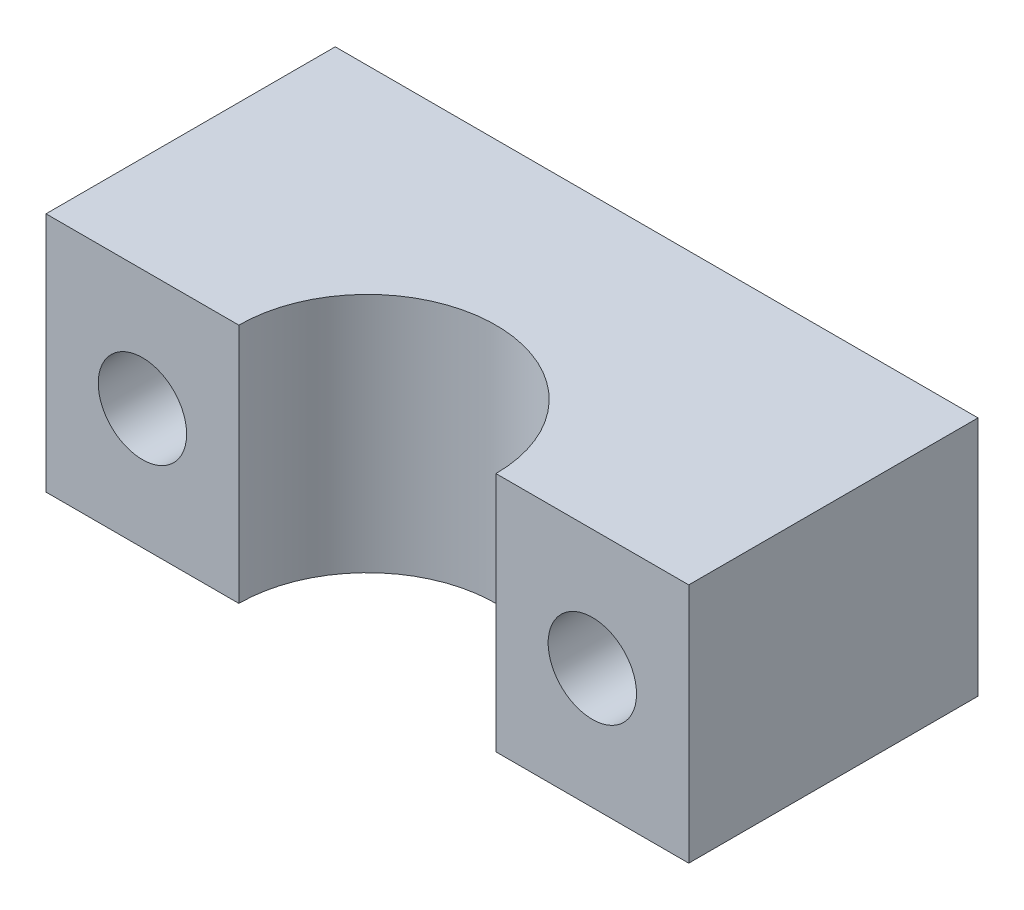
ISO-10303-21;
HEADER;
FILE_DESCRIPTION(('STEP AP214'),'2;1');
FILE_NAME('part.step','',(''),(''),'','','');
FILE_SCHEMA(('AUTOMOTIVE_DESIGN { 1 0 10303 214 1 1 1 1 }'));
ENDSEC;
DATA;
#1=APPLICATION_CONTEXT('core data for automotive mechanical design processes');
#2=APPLICATION_PROTOCOL_DEFINITION('international standard','automotive_design',2000,#1);
#3=PRODUCT_CONTEXT('',#1,'mechanical');
#4=PRODUCT('Part','Part','',(#3));
#5=PRODUCT_RELATED_PRODUCT_CATEGORY('part','',(#4));
#6=PRODUCT_DEFINITION_FORMATION('','',#4);
#7=PRODUCT_DEFINITION_CONTEXT('part definition',#1,'design');
#8=PRODUCT_DEFINITION('design','',#6,#7);
#9=PRODUCT_DEFINITION_SHAPE('','',#8);
#10=(LENGTH_UNIT() NAMED_UNIT(*) SI_UNIT(.MILLI.,.METRE.));
#11=(NAMED_UNIT(*) PLANE_ANGLE_UNIT() SI_UNIT($,.RADIAN.));
#12=(NAMED_UNIT(*) SI_UNIT($,.STERADIAN.) SOLID_ANGLE_UNIT());
#13=UNCERTAINTY_MEASURE_WITH_UNIT(LENGTH_MEASURE(1.E-05),#10,'distance_accuracy_value','');
#14=(GEOMETRIC_REPRESENTATION_CONTEXT(3) GLOBAL_UNCERTAINTY_ASSIGNED_CONTEXT((#13)) GLOBAL_UNIT_ASSIGNED_CONTEXT((#10,
#11,#12)) REPRESENTATION_CONTEXT('',''));
#15=CARTESIAN_POINT('',(0.,0.,0.));
#16=DIRECTION('',(0.,0.,1.));
#17=DIRECTION('',(1.,0.,0.));
#18=AXIS2_PLACEMENT_3D('',#15,#16,#17);
#19=CARTESIAN_POINT('',(0.,0.,18.));
#20=DIRECTION('',(0.,0.,1.));
#21=DIRECTION('',(1.,0.,0.));
#22=AXIS2_PLACEMENT_3D('',#19,#20,#21);
#23=PLANE('',#22);
#24=CARTESIAN_POINT('',(34.,-7.5,18.));
#25=DIRECTION('',(0.,0.,1.));
#26=DIRECTION('',(1.,0.,0.));
#27=AXIS2_PLACEMENT_3D('',#24,#25,#26);
#28=CIRCLE('',#27,2.75);
#29=CARTESIAN_POINT('',(36.75,-7.5,18.));
#30=VERTEX_POINT('',#29);
#31=EDGE_CURVE('E149',#30,#30,#28,.T.);
#32=ORIENTED_EDGE('',*,*,#31,.F.);
#33=EDGE_LOOP('',(#32));
#34=FACE_BOUND('',#33,.T.);
#35=DIRECTION('',(0.,1.,0.));
#36=VECTOR('',#35,1.);
#37=CARTESIAN_POINT('',(28.,-15.,18.));
#38=LINE('',#37,#36);
#39=CARTESIAN_POINT('',(28.,-15.,18.));
#40=VERTEX_POINT('',#39);
#41=CARTESIAN_POINT('',(28.,0.,18.));
#42=VERTEX_POINT('',#41);
#43=EDGE_CURVE('E11',#40,#42,#38,.T.);
#44=ORIENTED_EDGE('',*,*,#43,.F.);
#45=DIRECTION('',(1.,0.,0.));
#46=VECTOR('',#45,1.);
#47=CARTESIAN_POINT('',(0.,-15.,18.));
#48=LINE('',#47,#46);
#49=CARTESIAN_POINT('',(40.,-15.,18.));
#50=VERTEX_POINT('',#49);
#51=EDGE_CURVE('E136',#40,#50,#48,.T.);
#52=ORIENTED_EDGE('',*,*,#51,.T.);
#53=DIRECTION('',(0.,1.,0.));
#54=VECTOR('',#53,1.);
#55=CARTESIAN_POINT('',(40.,0.,18.));
#56=LINE('',#55,#54);
#57=CARTESIAN_POINT('',(40.,0.,18.));
#58=VERTEX_POINT('',#57);
#59=EDGE_CURVE('E111',#50,#58,#56,.T.);
#60=ORIENTED_EDGE('',*,*,#59,.T.);
#61=DIRECTION('',(-1.,0.,0.));
#62=VECTOR('',#61,1.);
#63=CARTESIAN_POINT('',(0.,0.,18.));
#64=LINE('',#63,#62);
#65=EDGE_CURVE('E107',#58,#42,#64,.T.);
#66=ORIENTED_EDGE('',*,*,#65,.T.);
#67=EDGE_LOOP('',(#44,#52,#60,#66));
#68=FACE_BOUND('',#67,.T.);
#69=ADVANCED_FACE('F39',(#34,#68),#23,.T.);
#70=CARTESIAN_POINT('',(0.,0.,18.));
#71=DIRECTION('',(1.,0.,0.));
#72=DIRECTION('',(0.,0.,-1.));
#73=AXIS2_PLACEMENT_3D('',#70,#71,#72);
#74=PLANE('',#73);
#75=DIRECTION('',(0.,-1.,0.));
#76=VECTOR('',#75,1.);
#77=CARTESIAN_POINT('',(0.,0.,0.));
#78=LINE('',#77,#76);
#79=CARTESIAN_POINT('',(0.,0.,0.));
#80=VERTEX_POINT('',#79);
#81=CARTESIAN_POINT('',(0.,-15.,0.));
#82=VERTEX_POINT('',#81);
#83=EDGE_CURVE('E120',#80,#82,#78,.T.);
#84=ORIENTED_EDGE('',*,*,#83,.T.);
#85=DIRECTION('',(0.,0.,-1.));
#86=VECTOR('',#85,1.);
#87=CARTESIAN_POINT('',(0.,-15.,18.));
#88=LINE('',#87,#86);
#89=CARTESIAN_POINT('',(0.,-15.,18.));
#90=VERTEX_POINT('',#89);
#91=EDGE_CURVE('E133',#90,#82,#88,.T.);
#92=ORIENTED_EDGE('',*,*,#91,.F.);
#93=DIRECTION('',(0.,-1.,0.));
#94=VECTOR('',#93,1.);
#95=CARTESIAN_POINT('',(0.,0.,18.));
#96=LINE('',#95,#94);
#97=CARTESIAN_POINT('',(0.,0.,18.));
#98=VERTEX_POINT('',#97);
#99=EDGE_CURVE('E127',#98,#90,#96,.T.);
#100=ORIENTED_EDGE('',*,*,#99,.F.);
#101=DIRECTION('',(0.,0.,-1.));
#102=VECTOR('',#101,1.);
#103=CARTESIAN_POINT('',(0.,0.,18.));
#104=LINE('',#103,#102);
#105=EDGE_CURVE('E113',#98,#80,#104,.T.);
#106=ORIENTED_EDGE('',*,*,#105,.T.);
#107=EDGE_LOOP('',(#84,#92,#100,#106));
#108=FACE_BOUND('',#107,.T.);
#109=ADVANCED_FACE('F41',(#108),#74,.F.);
#110=CARTESIAN_POINT('',(0.,-15.,18.));
#111=DIRECTION('',(0.,1.,0.));
#112=DIRECTION('',(0.,0.,1.));
#113=AXIS2_PLACEMENT_3D('',#110,#111,#112);
#114=PLANE('',#113);
#115=ORIENTED_EDGE('',*,*,#51,.F.);
#116=CARTESIAN_POINT('',(20.,-15.,18.));
#117=DIRECTION('',(0.,1.,0.));
#118=DIRECTION('',(0.,0.,1.));
#119=AXIS2_PLACEMENT_3D('',#116,#117,#118);
#120=CIRCLE('',#119,8.);
#121=CARTESIAN_POINT('',(12.,-15.,18.));
#122=VERTEX_POINT('',#121);
#123=EDGE_CURVE('E101',#40,#122,#120,.T.);
#124=ORIENTED_EDGE('',*,*,#123,.T.);
#125=EDGE_CURVE('E91',#90,#122,#48,.T.);
#126=ORIENTED_EDGE('',*,*,#125,.F.);
#127=ORIENTED_EDGE('',*,*,#91,.T.);
#128=DIRECTION('',(1.,0.,0.));
#129=VECTOR('',#128,1.);
#130=CARTESIAN_POINT('',(0.,-15.,0.));
#131=LINE('',#130,#129);
#132=CARTESIAN_POINT('',(40.,-15.,0.));
#133=VERTEX_POINT('',#132);
#134=EDGE_CURVE('E123',#82,#133,#131,.T.);
#135=ORIENTED_EDGE('',*,*,#134,.T.);
#136=DIRECTION('',(0.,0.,-1.));
#137=VECTOR('',#136,1.);
#138=CARTESIAN_POINT('',(40.,-15.,18.));
#139=LINE('',#138,#137);
#140=EDGE_CURVE('E130',#50,#133,#139,.T.);
#141=ORIENTED_EDGE('',*,*,#140,.F.);
#142=EDGE_LOOP('',(#115,#124,#126,#127,#135,#141));
#143=FACE_BOUND('',#142,.T.);
#144=ADVANCED_FACE('F134',(#143),#114,.F.);
#145=CARTESIAN_POINT('',(40.,0.,18.));
#146=DIRECTION('',(-1.,0.,0.));
#147=DIRECTION('',(0.,0.,1.));
#148=AXIS2_PLACEMENT_3D('',#145,#146,#147);
#149=PLANE('',#148);
#150=DIRECTION('',(0.,1.,0.));
#151=VECTOR('',#150,1.);
#152=CARTESIAN_POINT('',(40.,0.,0.));
#153=LINE('',#152,#151);
#154=CARTESIAN_POINT('',(40.,0.,0.));
#155=VERTEX_POINT('',#154);
#156=EDGE_CURVE('E125',#133,#155,#153,.T.);
#157=ORIENTED_EDGE('',*,*,#156,.T.);
#158=DIRECTION('',(0.,0.,-1.));
#159=VECTOR('',#158,1.);
#160=CARTESIAN_POINT('',(40.,0.,18.));
#161=LINE('',#160,#159);
#162=EDGE_CURVE('E115',#58,#155,#161,.T.);
#163=ORIENTED_EDGE('',*,*,#162,.F.);
#164=ORIENTED_EDGE('',*,*,#59,.F.);
#165=ORIENTED_EDGE('',*,*,#140,.T.);
#166=EDGE_LOOP('',(#157,#163,#164,#165));
#167=FACE_BOUND('',#166,.T.);
#168=ADVANCED_FACE('F180',(#167),#149,.F.);
#169=CARTESIAN_POINT('',(0.,0.,18.));
#170=DIRECTION('',(0.,-1.,0.));
#171=DIRECTION('',(0.,0.,-1.));
#172=AXIS2_PLACEMENT_3D('',#169,#170,#171);
#173=PLANE('',#172);
#174=CARTESIAN_POINT('',(12.,0.,18.));
#175=VERTEX_POINT('',#174);
#176=EDGE_CURVE('E61',#175,#98,#64,.T.);
#177=ORIENTED_EDGE('',*,*,#176,.F.);
#178=CARTESIAN_POINT('',(20.,0.,18.));
#179=DIRECTION('',(0.,1.,0.));
#180=DIRECTION('',(0.,0.,1.));
#181=AXIS2_PLACEMENT_3D('',#178,#179,#180);
#182=CIRCLE('',#181,8.);
#183=EDGE_CURVE('E53',#42,#175,#182,.T.);
#184=ORIENTED_EDGE('',*,*,#183,.F.);
#185=ORIENTED_EDGE('',*,*,#65,.F.);
#186=ORIENTED_EDGE('',*,*,#162,.T.);
#187=DIRECTION('',(-1.,0.,0.));
#188=VECTOR('',#187,1.);
#189=CARTESIAN_POINT('',(0.,0.,0.));
#190=LINE('',#189,#188);
#191=EDGE_CURVE('E83',#155,#80,#190,.T.);
#192=ORIENTED_EDGE('',*,*,#191,.T.);
#193=ORIENTED_EDGE('',*,*,#105,.F.);
#194=EDGE_LOOP('',(#177,#184,#185,#186,#192,#193));
#195=FACE_BOUND('',#194,.T.);
#196=ADVANCED_FACE('F106',(#195),#173,.F.);
#197=CARTESIAN_POINT('',(6.,-7.5,18.));
#198=DIRECTION('',(0.,0.,1.));
#199=DIRECTION('',(1.,0.,0.));
#200=AXIS2_PLACEMENT_3D('',#197,#198,#199);
#201=CIRCLE('',#200,2.75);
#202=CARTESIAN_POINT('',(8.75,-7.5,18.));
#203=VERTEX_POINT('',#202);
#204=EDGE_CURVE('E143',#203,#203,#201,.T.);
#205=ORIENTED_EDGE('',*,*,#204,.F.);
#206=EDGE_LOOP('',(#205));
#207=FACE_BOUND('',#206,.T.);
#208=DIRECTION('',(0.,1.,0.));
#209=VECTOR('',#208,1.);
#210=CARTESIAN_POINT('',(12.,-15.,18.));
#211=LINE('',#210,#209);
#212=EDGE_CURVE('E47',#175,#122,#211,.F.);
#213=ORIENTED_EDGE('',*,*,#212,.F.);
#214=ORIENTED_EDGE('',*,*,#176,.T.);
#215=ORIENTED_EDGE('',*,*,#99,.T.);
#216=ORIENTED_EDGE('',*,*,#125,.T.);
#217=EDGE_LOOP('',(#213,#214,#215,#216));
#218=FACE_BOUND('',#217,.T.);
#219=ADVANCED_FACE('F138',(#207,#218),#23,.T.);
#220=CARTESIAN_POINT('',(0.,0.,0.));
#221=DIRECTION('',(0.,0.,1.));
#222=DIRECTION('',(1.,0.,0.));
#223=AXIS2_PLACEMENT_3D('',#220,#221,#222);
#224=PLANE('',#223);
#225=CARTESIAN_POINT('',(34.,-7.5,0.));
#226=DIRECTION('',(0.,0.,1.));
#227=DIRECTION('',(1.,0.,0.));
#228=AXIS2_PLACEMENT_3D('',#225,#226,#227);
#229=CIRCLE('',#228,2.75);
#230=CARTESIAN_POINT('',(36.75,-7.5,0.));
#231=VERTEX_POINT('',#230);
#232=EDGE_CURVE('E108',#231,#231,#229,.T.);
#233=ORIENTED_EDGE('',*,*,#232,.T.);
#234=EDGE_LOOP('',(#233));
#235=FACE_BOUND('',#234,.T.);
#236=CARTESIAN_POINT('',(6.,-7.5,0.));
#237=DIRECTION('',(0.,0.,1.));
#238=DIRECTION('',(1.,0.,0.));
#239=AXIS2_PLACEMENT_3D('',#236,#237,#238);
#240=CIRCLE('',#239,2.75);
#241=CARTESIAN_POINT('',(8.75,-7.5,0.));
#242=VERTEX_POINT('',#241);
#243=EDGE_CURVE('E146',#242,#242,#240,.T.);
#244=ORIENTED_EDGE('',*,*,#243,.T.);
#245=EDGE_LOOP('',(#244));
#246=FACE_BOUND('',#245,.T.);
#247=ORIENTED_EDGE('',*,*,#83,.F.);
#248=ORIENTED_EDGE('',*,*,#191,.F.);
#249=ORIENTED_EDGE('',*,*,#156,.F.);
#250=ORIENTED_EDGE('',*,*,#134,.F.);
#251=EDGE_LOOP('',(#247,#248,#249,#250));
#252=FACE_BOUND('',#251,.T.);
#253=ADVANCED_FACE('F155',(#235,#246,#252),#224,.F.);
#254=CARTESIAN_POINT('',(20.,-15.,18.));
#255=DIRECTION('',(0.,1.,0.));
#256=DIRECTION('',(0.,0.,1.));
#257=AXIS2_PLACEMENT_3D('',#254,#255,#256);
#258=CYLINDRICAL_SURFACE('',#257,8.);
#259=ORIENTED_EDGE('',*,*,#43,.T.);
#260=ORIENTED_EDGE('',*,*,#183,.T.);
#261=ORIENTED_EDGE('',*,*,#212,.T.);
#262=ORIENTED_EDGE('',*,*,#123,.F.);
#263=EDGE_LOOP('',(#259,#260,#261,#262));
#264=FACE_BOUND('',#263,.T.);
#265=ADVANCED_FACE('F100',(#264),#258,.F.);
#266=CARTESIAN_POINT('',(6.,-7.5,0.));
#267=DIRECTION('',(0.,0.,1.));
#268=DIRECTION('',(1.,0.,0.));
#269=AXIS2_PLACEMENT_3D('',#266,#267,#268);
#270=CYLINDRICAL_SURFACE('',#269,2.75);
#271=ORIENTED_EDGE('',*,*,#243,.F.);
#272=EDGE_LOOP('',(#271));
#273=FACE_BOUND('',#272,.T.);
#274=ORIENTED_EDGE('',*,*,#204,.T.);
#275=EDGE_LOOP('',(#274));
#276=FACE_BOUND('',#275,.T.);
#277=ADVANCED_FACE('F161',(#273,#276),#270,.F.);
#278=CARTESIAN_POINT('',(34.,-7.5,0.));
#279=DIRECTION('',(0.,0.,1.));
#280=DIRECTION('',(1.,0.,0.));
#281=AXIS2_PLACEMENT_3D('',#278,#279,#280);
#282=CYLINDRICAL_SURFACE('',#281,2.75);
#283=ORIENTED_EDGE('',*,*,#232,.F.);
#284=EDGE_LOOP('',(#283));
#285=FACE_BOUND('',#284,.T.);
#286=ORIENTED_EDGE('',*,*,#31,.T.);
#287=EDGE_LOOP('',(#286));
#288=FACE_BOUND('',#287,.T.);
#289=ADVANCED_FACE('F158',(#285,#288),#282,.F.);
#290=CLOSED_SHELL('',(#69,#109,#144,#168,#196,#219,#253,#265,#277,#289));
#291=MANIFOLD_SOLID_BREP('B2',#290);
#292=ADVANCED_BREP_SHAPE_REPRESENTATION('',(#18,#291),#14);
#293=SHAPE_DEFINITION_REPRESENTATION(#9,#292);
ENDSEC;
END-ISO-10303-21;
